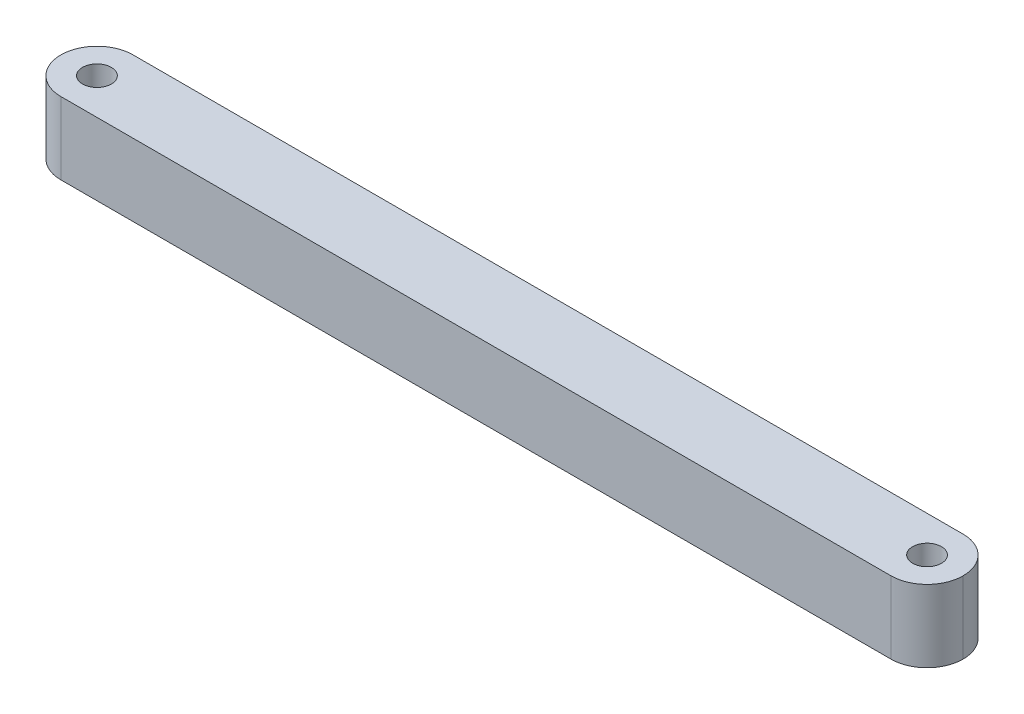
ISO-10303-21;
HEADER;
FILE_DESCRIPTION(('STEP AP214'),'2;1');
FILE_NAME('part.step','',(''),(''),'','','');
FILE_SCHEMA(('AUTOMOTIVE_DESIGN { 1 0 10303 214 1 1 1 1 }'));
ENDSEC;
DATA;
#1=APPLICATION_CONTEXT('core data for automotive mechanical design processes');
#2=APPLICATION_PROTOCOL_DEFINITION('international standard','automotive_design',2000,#1);
#3=PRODUCT_CONTEXT('',#1,'mechanical');
#4=PRODUCT('Part','Part','',(#3));
#5=PRODUCT_RELATED_PRODUCT_CATEGORY('part','',(#4));
#6=PRODUCT_DEFINITION_FORMATION('','',#4);
#7=PRODUCT_DEFINITION_CONTEXT('part definition',#1,'design');
#8=PRODUCT_DEFINITION('design','',#6,#7);
#9=PRODUCT_DEFINITION_SHAPE('','',#8);
#10=(LENGTH_UNIT() NAMED_UNIT(*) SI_UNIT(.MILLI.,.METRE.));
#11=(NAMED_UNIT(*) PLANE_ANGLE_UNIT() SI_UNIT($,.RADIAN.));
#12=(NAMED_UNIT(*) SI_UNIT($,.STERADIAN.) SOLID_ANGLE_UNIT());
#13=UNCERTAINTY_MEASURE_WITH_UNIT(LENGTH_MEASURE(1.E-05),#10,'distance_accuracy_value','');
#14=(GEOMETRIC_REPRESENTATION_CONTEXT(3) GLOBAL_UNCERTAINTY_ASSIGNED_CONTEXT((#13)) GLOBAL_UNIT_ASSIGNED_CONTEXT((#10,
#11,#12)) REPRESENTATION_CONTEXT('',''));
#15=CARTESIAN_POINT('',(0.,0.,0.));
#16=DIRECTION('',(0.,0.,1.));
#17=DIRECTION('',(1.,0.,0.));
#18=AXIS2_PLACEMENT_3D('',#15,#16,#17);
#19=CARTESIAN_POINT('',(-62.5,5.,10.));
#20=DIRECTION('',(0.,-1.,0.));
#21=DIRECTION('',(0.,0.,-1.));
#22=AXIS2_PLACEMENT_3D('',#19,#20,#21);
#23=PLANE('',#22);
#24=CARTESIAN_POINT('',(-57.5,5.,5.));
#25=DIRECTION('',(0.,1.,0.));
#26=DIRECTION('',(0.,0.,1.));
#27=AXIS2_PLACEMENT_3D('',#24,#25,#26);
#28=CIRCLE('',#27,2.);
#29=CARTESIAN_POINT('',(-57.5,5.,7.));
#30=VERTEX_POINT('',#29);
#31=EDGE_CURVE('E169',#30,#30,#28,.T.);
#32=ORIENTED_EDGE('',*,*,#31,.F.);
#33=EDGE_LOOP('',(#32));
#34=FACE_BOUND('',#33,.T.);
#35=CARTESIAN_POINT('',(57.5,5.,5.));
#36=DIRECTION('',(0.,1.,0.));
#37=DIRECTION('',(0.,0.,1.));
#38=AXIS2_PLACEMENT_3D('',#35,#36,#37);
#39=CIRCLE('',#38,2.);
#40=CARTESIAN_POINT('',(57.5,5.,7.));
#41=VERTEX_POINT('',#40);
#42=EDGE_CURVE('E175',#41,#41,#39,.T.);
#43=ORIENTED_EDGE('',*,*,#42,.F.);
#44=EDGE_LOOP('',(#43));
#45=FACE_BOUND('',#44,.T.);
#46=DIRECTION('',(-1.,0.,0.));
#47=VECTOR('',#46,1.);
#48=CARTESIAN_POINT('',(-62.5,5.,10.));
#49=LINE('',#48,#47);
#50=CARTESIAN_POINT('',(57.5,5.,10.));
#51=VERTEX_POINT('',#50);
#52=CARTESIAN_POINT('',(-57.5,5.,10.));
#53=VERTEX_POINT('',#52);
#54=EDGE_CURVE('E117',#51,#53,#49,.T.);
#55=ORIENTED_EDGE('',*,*,#54,.F.);
#56=CARTESIAN_POINT('',(57.5,5.,5.));
#57=DIRECTION('',(0.,-1.,0.));
#58=DIRECTION('',(0.,0.,-1.));
#59=AXIS2_PLACEMENT_3D('',#56,#57,#58);
#60=CIRCLE('',#59,5.);
#61=CARTESIAN_POINT('',(62.5,5.,5.));
#62=VERTEX_POINT('',#61);
#63=EDGE_CURVE('E101',#51,#62,#60,.F.);
#64=ORIENTED_EDGE('',*,*,#63,.T.);
#65=CARTESIAN_POINT('',(57.5,5.,5.));
#66=DIRECTION('',(0.,-1.,0.));
#67=DIRECTION('',(0.,0.,-1.));
#68=AXIS2_PLACEMENT_3D('',#65,#66,#67);
#69=CIRCLE('',#68,5.);
#70=CARTESIAN_POINT('',(57.5,5.,0.));
#71=VERTEX_POINT('',#70);
#72=EDGE_CURVE('E111',#62,#71,#69,.F.);
#73=ORIENTED_EDGE('',*,*,#72,.T.);
#74=DIRECTION('',(-1.,0.,0.));
#75=VECTOR('',#74,1.);
#76=CARTESIAN_POINT('',(-62.5,5.,0.));
#77=LINE('',#76,#75);
#78=CARTESIAN_POINT('',(-57.5,5.,0.));
#79=VERTEX_POINT('',#78);
#80=EDGE_CURVE('E131',#71,#79,#77,.T.);
#81=ORIENTED_EDGE('',*,*,#80,.T.);
#82=CARTESIAN_POINT('',(-57.5,5.,5.));
#83=DIRECTION('',(0.,-1.,0.));
#84=DIRECTION('',(0.,0.,-1.));
#85=AXIS2_PLACEMENT_3D('',#82,#83,#84);
#86=CIRCLE('',#85,5.);
#87=CARTESIAN_POINT('',(-62.5,5.,5.));
#88=VERTEX_POINT('',#87);
#89=EDGE_CURVE('E144',#79,#88,#86,.F.);
#90=ORIENTED_EDGE('',*,*,#89,.T.);
#91=CARTESIAN_POINT('',(-57.5,5.,5.));
#92=DIRECTION('',(0.,-1.,0.));
#93=DIRECTION('',(0.,0.,-1.));
#94=AXIS2_PLACEMENT_3D('',#91,#92,#93);
#95=CIRCLE('',#94,5.);
#96=EDGE_CURVE('E121',#88,#53,#95,.F.);
#97=ORIENTED_EDGE('',*,*,#96,.T.);
#98=EDGE_LOOP('',(#55,#64,#73,#81,#90,#97));
#99=FACE_BOUND('',#98,.T.);
#100=ADVANCED_FACE('F45',(#34,#45,#99),#23,.F.);
#101=CARTESIAN_POINT('',(-62.5,-5.,10.));
#102=DIRECTION('',(0.,1.,0.));
#103=DIRECTION('',(0.,0.,1.));
#104=AXIS2_PLACEMENT_3D('',#101,#102,#103);
#105=PLANE('',#104);
#106=CARTESIAN_POINT('',(-57.5,-5.,5.));
#107=DIRECTION('',(0.,1.,0.));
#108=DIRECTION('',(0.,0.,1.));
#109=AXIS2_PLACEMENT_3D('',#106,#107,#108);
#110=CIRCLE('',#109,2.);
#111=CARTESIAN_POINT('',(-57.5,-5.,7.));
#112=VERTEX_POINT('',#111);
#113=EDGE_CURVE('E164',#112,#112,#110,.T.);
#114=ORIENTED_EDGE('',*,*,#113,.T.);
#115=EDGE_LOOP('',(#114));
#116=FACE_BOUND('',#115,.T.);
#117=CARTESIAN_POINT('',(57.5,-5.,5.));
#118=DIRECTION('',(0.,1.,0.));
#119=DIRECTION('',(0.,0.,1.));
#120=AXIS2_PLACEMENT_3D('',#117,#118,#119);
#121=CIRCLE('',#120,2.);
#122=CARTESIAN_POINT('',(57.5,-5.,7.));
#123=VERTEX_POINT('',#122);
#124=EDGE_CURVE('E134',#123,#123,#121,.T.);
#125=ORIENTED_EDGE('',*,*,#124,.T.);
#126=EDGE_LOOP('',(#125));
#127=FACE_BOUND('',#126,.T.);
#128=CARTESIAN_POINT('',(57.5,-5.,5.));
#129=DIRECTION('',(0.,1.,0.));
#130=DIRECTION('',(0.,0.,1.));
#131=AXIS2_PLACEMENT_3D('',#128,#129,#130);
#132=CIRCLE('',#131,5.);
#133=CARTESIAN_POINT('',(57.5,-5.,0.));
#134=VERTEX_POINT('',#133);
#135=CARTESIAN_POINT('',(62.5,-5.,5.));
#136=VERTEX_POINT('',#135);
#137=EDGE_CURVE('E70',#134,#136,#132,.F.);
#138=ORIENTED_EDGE('',*,*,#137,.T.);
#139=CARTESIAN_POINT('',(57.5,-5.,5.));
#140=DIRECTION('',(0.,1.,0.));
#141=DIRECTION('',(0.,0.,1.));
#142=AXIS2_PLACEMENT_3D('',#139,#140,#141);
#143=CIRCLE('',#142,5.);
#144=CARTESIAN_POINT('',(57.5,-5.,10.));
#145=VERTEX_POINT('',#144);
#146=EDGE_CURVE('E156',#136,#145,#143,.F.);
#147=ORIENTED_EDGE('',*,*,#146,.T.);
#148=DIRECTION('',(1.,0.,0.));
#149=VECTOR('',#148,1.);
#150=CARTESIAN_POINT('',(-62.5,-5.,10.));
#151=LINE('',#150,#149);
#152=CARTESIAN_POINT('',(-57.5,-5.,10.));
#153=VERTEX_POINT('',#152);
#154=EDGE_CURVE('E119',#153,#145,#151,.T.);
#155=ORIENTED_EDGE('',*,*,#154,.F.);
#156=CARTESIAN_POINT('',(-57.5,-5.,5.));
#157=DIRECTION('',(0.,1.,0.));
#158=DIRECTION('',(0.,0.,1.));
#159=AXIS2_PLACEMENT_3D('',#156,#157,#158);
#160=CIRCLE('',#159,5.);
#161=CARTESIAN_POINT('',(-62.5,-5.,5.));
#162=VERTEX_POINT('',#161);
#163=EDGE_CURVE('E63',#153,#162,#160,.F.);
#164=ORIENTED_EDGE('',*,*,#163,.T.);
#165=CARTESIAN_POINT('',(-57.5,-5.,5.));
#166=DIRECTION('',(0.,1.,0.));
#167=DIRECTION('',(0.,0.,1.));
#168=AXIS2_PLACEMENT_3D('',#165,#166,#167);
#169=CIRCLE('',#168,5.);
#170=CARTESIAN_POINT('',(-57.5,-5.,0.));
#171=VERTEX_POINT('',#170);
#172=EDGE_CURVE('E151',#162,#171,#169,.F.);
#173=ORIENTED_EDGE('',*,*,#172,.T.);
#174=DIRECTION('',(1.,0.,0.));
#175=VECTOR('',#174,1.);
#176=CARTESIAN_POINT('',(-62.5,-5.,0.));
#177=LINE('',#176,#175);
#178=EDGE_CURVE('E126',#171,#134,#177,.T.);
#179=ORIENTED_EDGE('',*,*,#178,.T.);
#180=EDGE_LOOP('',(#138,#147,#155,#164,#173,#179));
#181=FACE_BOUND('',#180,.T.);
#182=ADVANCED_FACE('F185',(#116,#127,#181),#105,.F.);
#183=CARTESIAN_POINT('',(0.,0.,10.));
#184=DIRECTION('',(0.,0.,-1.));
#185=DIRECTION('',(-1.,0.,0.));
#186=AXIS2_PLACEMENT_3D('',#183,#184,#185);
#187=PLANE('',#186);
#188=ORIENTED_EDGE('',*,*,#154,.T.);
#189=DIRECTION('',(0.,1.,0.));
#190=VECTOR('',#189,1.);
#191=CARTESIAN_POINT('',(57.5,0.,10.));
#192=LINE('',#191,#190);
#193=EDGE_CURVE('E105',#145,#51,#192,.T.);
#194=ORIENTED_EDGE('',*,*,#193,.T.);
#195=ORIENTED_EDGE('',*,*,#54,.T.);
#196=DIRECTION('',(0.,-1.,0.));
#197=VECTOR('',#196,1.);
#198=CARTESIAN_POINT('',(-57.5,0.,10.));
#199=LINE('',#198,#197);
#200=EDGE_CURVE('E122',#53,#153,#199,.T.);
#201=ORIENTED_EDGE('',*,*,#200,.T.);
#202=EDGE_LOOP('',(#188,#194,#195,#201));
#203=FACE_BOUND('',#202,.T.);
#204=ADVANCED_FACE('F116',(#203),#187,.F.);
#205=CARTESIAN_POINT('',(0.,0.,0.));
#206=DIRECTION('',(0.,0.,-1.));
#207=DIRECTION('',(-1.,0.,0.));
#208=AXIS2_PLACEMENT_3D('',#205,#206,#207);
#209=PLANE('',#208);
#210=ORIENTED_EDGE('',*,*,#80,.F.);
#211=DIRECTION('',(0.,1.,0.));
#212=VECTOR('',#211,1.);
#213=CARTESIAN_POINT('',(57.5,-5.,0.));
#214=LINE('',#213,#212);
#215=EDGE_CURVE('E11',#71,#134,#214,.F.);
#216=ORIENTED_EDGE('',*,*,#215,.T.);
#217=ORIENTED_EDGE('',*,*,#178,.F.);
#218=DIRECTION('',(0.,-1.,0.));
#219=VECTOR('',#218,1.);
#220=CARTESIAN_POINT('',(-57.5,5.,0.));
#221=LINE('',#220,#219);
#222=EDGE_CURVE('E55',#171,#79,#221,.F.);
#223=ORIENTED_EDGE('',*,*,#222,.T.);
#224=EDGE_LOOP('',(#210,#216,#217,#223));
#225=FACE_BOUND('',#224,.T.);
#226=ADVANCED_FACE('F214',(#225),#209,.T.);
#227=CARTESIAN_POINT('',(57.5,-5.,5.));
#228=DIRECTION('',(0.,-1.,0.));
#229=DIRECTION('',(0.,0.,-1.));
#230=AXIS2_PLACEMENT_3D('',#227,#228,#229);
#231=CYLINDRICAL_SURFACE('',#230,5.);
#232=DIRECTION('',(0.,1.,0.));
#233=VECTOR('',#232,1.);
#234=CARTESIAN_POINT('',(62.5,5.,5.));
#235=LINE('',#234,#233);
#236=EDGE_CURVE('E106',#136,#62,#235,.T.);
#237=ORIENTED_EDGE('',*,*,#236,.F.);
#238=ORIENTED_EDGE('',*,*,#137,.F.);
#239=ORIENTED_EDGE('',*,*,#215,.F.);
#240=ORIENTED_EDGE('',*,*,#72,.F.);
#241=EDGE_LOOP('',(#237,#238,#239,#240));
#242=FACE_BOUND('',#241,.T.);
#243=ADVANCED_FACE('F212',(#242),#231,.T.);
#244=CARTESIAN_POINT('',(57.5,0.,5.));
#245=DIRECTION('',(0.,1.,0.));
#246=DIRECTION('',(0.,0.,1.));
#247=AXIS2_PLACEMENT_3D('',#244,#245,#246);
#248=CYLINDRICAL_SURFACE('',#247,5.);
#249=ORIENTED_EDGE('',*,*,#146,.F.);
#250=ORIENTED_EDGE('',*,*,#236,.T.);
#251=ORIENTED_EDGE('',*,*,#63,.F.);
#252=ORIENTED_EDGE('',*,*,#193,.F.);
#253=EDGE_LOOP('',(#249,#250,#251,#252));
#254=FACE_BOUND('',#253,.T.);
#255=ADVANCED_FACE('F104',(#254),#248,.T.);
#256=CARTESIAN_POINT('',(-57.5,0.,5.));
#257=DIRECTION('',(0.,-1.,0.));
#258=DIRECTION('',(0.,0.,-1.));
#259=AXIS2_PLACEMENT_3D('',#256,#257,#258);
#260=CYLINDRICAL_SURFACE('',#259,5.);
#261=ORIENTED_EDGE('',*,*,#200,.F.);
#262=ORIENTED_EDGE('',*,*,#96,.F.);
#263=DIRECTION('',(0.,-1.,0.));
#264=VECTOR('',#263,1.);
#265=CARTESIAN_POINT('',(-62.5,-5.,5.));
#266=LINE('',#265,#264);
#267=EDGE_CURVE('E49',#162,#88,#266,.F.);
#268=ORIENTED_EDGE('',*,*,#267,.F.);
#269=ORIENTED_EDGE('',*,*,#163,.F.);
#270=EDGE_LOOP('',(#261,#262,#268,#269));
#271=FACE_BOUND('',#270,.T.);
#272=ADVANCED_FACE('F47',(#271),#260,.T.);
#273=CARTESIAN_POINT('',(-57.5,-5.,5.));
#274=DIRECTION('',(0.,1.,0.));
#275=DIRECTION('',(0.,0.,1.));
#276=AXIS2_PLACEMENT_3D('',#273,#274,#275);
#277=CYLINDRICAL_SURFACE('',#276,5.);
#278=ORIENTED_EDGE('',*,*,#89,.F.);
#279=ORIENTED_EDGE('',*,*,#222,.F.);
#280=ORIENTED_EDGE('',*,*,#172,.F.);
#281=ORIENTED_EDGE('',*,*,#267,.T.);
#282=EDGE_LOOP('',(#278,#279,#280,#281));
#283=FACE_BOUND('',#282,.T.);
#284=ADVANCED_FACE('F190',(#283),#277,.T.);
#285=CARTESIAN_POINT('',(57.5,-5.,5.));
#286=DIRECTION('',(0.,1.,0.));
#287=DIRECTION('',(0.,0.,1.));
#288=AXIS2_PLACEMENT_3D('',#285,#286,#287);
#289=CYLINDRICAL_SURFACE('',#288,2.);
#290=ORIENTED_EDGE('',*,*,#124,.F.);
#291=EDGE_LOOP('',(#290));
#292=FACE_BOUND('',#291,.T.);
#293=ORIENTED_EDGE('',*,*,#42,.T.);
#294=EDGE_LOOP('',(#293));
#295=FACE_BOUND('',#294,.T.);
#296=ADVANCED_FACE('F187',(#292,#295),#289,.F.);
#297=CARTESIAN_POINT('',(-57.5,-5.,5.));
#298=DIRECTION('',(0.,1.,0.));
#299=DIRECTION('',(0.,0.,1.));
#300=AXIS2_PLACEMENT_3D('',#297,#298,#299);
#301=CYLINDRICAL_SURFACE('',#300,2.);
#302=ORIENTED_EDGE('',*,*,#113,.F.);
#303=EDGE_LOOP('',(#302));
#304=FACE_BOUND('',#303,.T.);
#305=ORIENTED_EDGE('',*,*,#31,.T.);
#306=EDGE_LOOP('',(#305));
#307=FACE_BOUND('',#306,.T.);
#308=ADVANCED_FACE('F189',(#304,#307),#301,.F.);
#309=CLOSED_SHELL('',(#100,#182,#204,#226,#243,#255,#272,#284,#296,#308));
#310=MANIFOLD_SOLID_BREP('B2',#309);
#311=ADVANCED_BREP_SHAPE_REPRESENTATION('',(#18,#310),#14);
#312=SHAPE_DEFINITION_REPRESENTATION(#9,#311);
ENDSEC;
END-ISO-10303-21;
